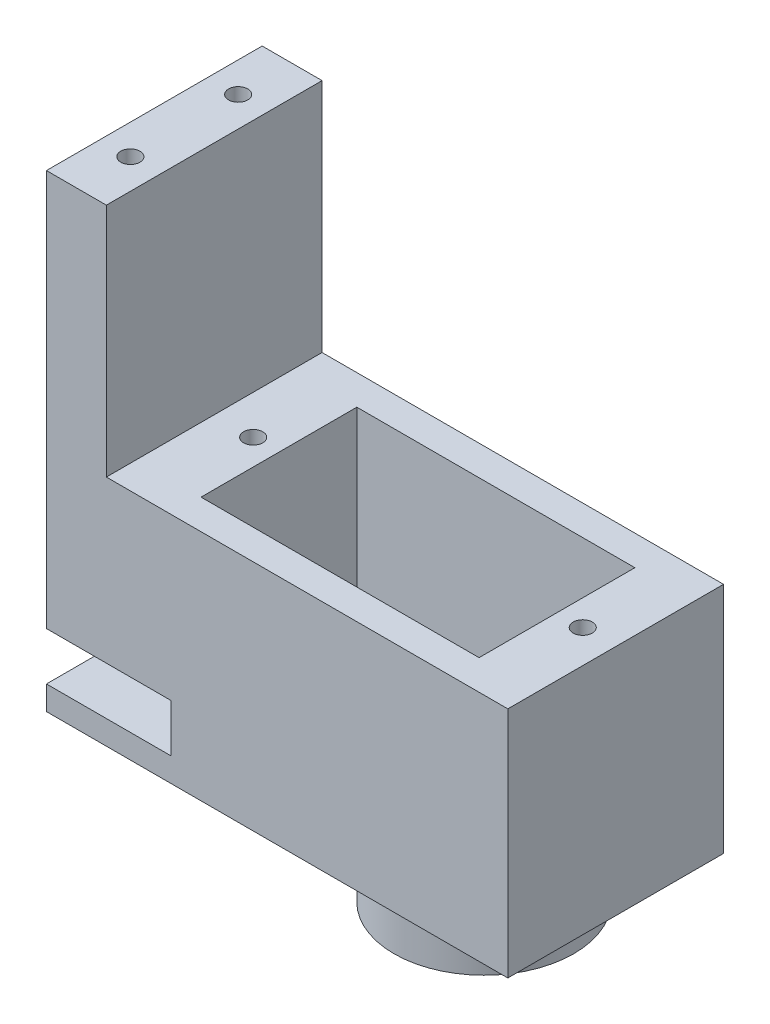
ISO-10303-21;
HEADER;
FILE_DESCRIPTION(('STEP AP214'),'2;1');
FILE_NAME('part.step','',(''),(''),'','','');
FILE_SCHEMA(('AUTOMOTIVE_DESIGN { 1 0 10303 214 1 1 1 1 }'));
ENDSEC;
DATA;
#1=APPLICATION_CONTEXT('core data for automotive mechanical design processes');
#2=APPLICATION_PROTOCOL_DEFINITION('international standard','automotive_design',2000,#1);
#3=PRODUCT_CONTEXT('',#1,'mechanical');
#4=PRODUCT('Part','Part','',(#3));
#5=PRODUCT_RELATED_PRODUCT_CATEGORY('part','',(#4));
#6=PRODUCT_DEFINITION_FORMATION('','',#4);
#7=PRODUCT_DEFINITION_CONTEXT('part definition',#1,'design');
#8=PRODUCT_DEFINITION('design','',#6,#7);
#9=PRODUCT_DEFINITION_SHAPE('','',#8);
#10=(LENGTH_UNIT() NAMED_UNIT(*) SI_UNIT(.MILLI.,.METRE.));
#11=(NAMED_UNIT(*) PLANE_ANGLE_UNIT() SI_UNIT($,.RADIAN.));
#12=(NAMED_UNIT(*) SI_UNIT($,.STERADIAN.) SOLID_ANGLE_UNIT());
#13=UNCERTAINTY_MEASURE_WITH_UNIT(LENGTH_MEASURE(1.E-05),#10,'distance_accuracy_value','');
#14=(GEOMETRIC_REPRESENTATION_CONTEXT(3) GLOBAL_UNCERTAINTY_ASSIGNED_CONTEXT((#13)) GLOBAL_UNIT_ASSIGNED_CONTEXT((#10,
#11,#12)) REPRESENTATION_CONTEXT('',''));
#15=CARTESIAN_POINT('',(0.,0.,0.));
#16=DIRECTION('',(0.,0.,1.));
#17=DIRECTION('',(1.,0.,0.));
#18=AXIS2_PLACEMENT_3D('',#15,#16,#17);
#19=CARTESIAN_POINT('',(-22.,-14.3,9.));
#20=DIRECTION('',(1.,0.,0.));
#21=DIRECTION('',(0.,0.,-1.));
#22=AXIS2_PLACEMENT_3D('',#19,#20,#21);
#23=PLANE('',#22);
#24=DIRECTION('',(0.,-1.,0.));
#25=VECTOR('',#24,1.);
#26=CARTESIAN_POINT('',(-22.,-14.3,-9.));
#27=LINE('',#26,#25);
#28=CARTESIAN_POINT('',(-22.,24.8,-9.));
#29=VERTEX_POINT('',#28);
#30=CARTESIAN_POINT('',(-22.,-8.3,-9.));
#31=VERTEX_POINT('',#30);
#32=EDGE_CURVE('E199',#29,#31,#27,.T.);
#33=ORIENTED_EDGE('',*,*,#32,.T.);
#34=DIRECTION('',(0.,0.,1.));
#35=VECTOR('',#34,1.);
#36=CARTESIAN_POINT('',(-22.,-8.3,-9.));
#37=LINE('',#36,#35);
#38=CARTESIAN_POINT('',(-22.,-8.3,9.));
#39=VERTEX_POINT('',#38);
#40=EDGE_CURVE('E312',#31,#39,#37,.T.);
#41=ORIENTED_EDGE('',*,*,#40,.T.);
#42=DIRECTION('',(0.,-1.,0.));
#43=VECTOR('',#42,1.);
#44=CARTESIAN_POINT('',(-22.,-14.3,9.));
#45=LINE('',#44,#43);
#46=CARTESIAN_POINT('',(-22.,24.8,9.));
#47=VERTEX_POINT('',#46);
#48=EDGE_CURVE('E177',#47,#39,#45,.T.);
#49=ORIENTED_EDGE('',*,*,#48,.F.);
#50=DIRECTION('',(0.,0.,-1.));
#51=VECTOR('',#50,1.);
#52=CARTESIAN_POINT('',(-22.,24.8,9.));
#53=LINE('',#52,#51);
#54=EDGE_CURVE('E242',#47,#29,#53,.T.);
#55=ORIENTED_EDGE('',*,*,#54,.T.);
#56=EDGE_LOOP('',(#33,#41,#49,#55));
#57=FACE_BOUND('',#56,.T.);
#58=ADVANCED_FACE('F39',(#57),#23,.F.);
#59=CARTESIAN_POINT('',(-22.,5.15,9.));
#60=DIRECTION('',(0.,-1.,0.));
#61=DIRECTION('',(0.,0.,-1.));
#62=AXIS2_PLACEMENT_3D('',#59,#60,#61);
#63=PLANE('',#62);
#64=CARTESIAN_POINT('',(13.75,5.15,0.));
#65=DIRECTION('',(0.,1.,0.));
#66=DIRECTION('',(0.,0.,1.));
#67=AXIS2_PLACEMENT_3D('',#64,#65,#66);
#68=CIRCLE('',#67,0.800000000000001);
#69=CARTESIAN_POINT('',(13.75,5.15,0.800000000000001));
#70=VERTEX_POINT('',#69);
#71=EDGE_CURVE('E347',#70,#70,#68,.T.);
#72=ORIENTED_EDGE('',*,*,#71,.F.);
#73=EDGE_LOOP('',(#72));
#74=FACE_BOUND('',#73,.T.);
#75=CARTESIAN_POINT('',(-13.75,5.15,0.));
#76=DIRECTION('',(0.,1.,0.));
#77=DIRECTION('',(0.,0.,1.));
#78=AXIS2_PLACEMENT_3D('',#75,#76,#77);
#79=CIRCLE('',#78,0.800000000000001);
#80=CARTESIAN_POINT('',(-13.75,5.15,0.800000000000001));
#81=VERTEX_POINT('',#80);
#82=EDGE_CURVE('E339',#81,#81,#79,.T.);
#83=ORIENTED_EDGE('',*,*,#82,.F.);
#84=EDGE_LOOP('',(#83));
#85=FACE_BOUND('',#84,.T.);
#86=DIRECTION('',(1.,0.,0.));
#87=VECTOR('',#86,1.);
#88=CARTESIAN_POINT('',(-11.6,5.15,6.5));
#89=LINE('',#88,#87);
#90=CARTESIAN_POINT('',(-11.6,5.15,6.5));
#91=VERTEX_POINT('',#90);
#92=CARTESIAN_POINT('',(11.6,5.15,6.5));
#93=VERTEX_POINT('',#92);
#94=EDGE_CURVE('E291',#91,#93,#89,.T.);
#95=ORIENTED_EDGE('',*,*,#94,.F.);
#96=DIRECTION('',(0.,0.,1.));
#97=VECTOR('',#96,1.);
#98=CARTESIAN_POINT('',(-11.6,5.15,6.5));
#99=LINE('',#98,#97);
#100=CARTESIAN_POINT('',(-11.6,5.15,-6.5));
#101=VERTEX_POINT('',#100);
#102=EDGE_CURVE('E294',#101,#91,#99,.T.);
#103=ORIENTED_EDGE('',*,*,#102,.F.);
#104=DIRECTION('',(-1.,0.,0.));
#105=VECTOR('',#104,1.);
#106=CARTESIAN_POINT('',(-11.6,5.15,-6.5));
#107=LINE('',#106,#105);
#108=CARTESIAN_POINT('',(11.6,5.15,-6.5));
#109=VERTEX_POINT('',#108);
#110=EDGE_CURVE('E282',#109,#101,#107,.T.);
#111=ORIENTED_EDGE('',*,*,#110,.F.);
#112=DIRECTION('',(0.,0.,-1.));
#113=VECTOR('',#112,1.);
#114=CARTESIAN_POINT('',(11.6,5.15,6.5));
#115=LINE('',#114,#113);
#116=EDGE_CURVE('E287',#93,#109,#115,.T.);
#117=ORIENTED_EDGE('',*,*,#116,.F.);
#118=EDGE_LOOP('',(#95,#103,#111,#117));
#119=FACE_BOUND('',#118,.T.);
#120=DIRECTION('',(0.,0.,-1.));
#121=VECTOR('',#120,1.);
#122=CARTESIAN_POINT('',(-17.,5.15,9.));
#123=LINE('',#122,#121);
#124=CARTESIAN_POINT('',(-17.,5.15,9.));
#125=VERTEX_POINT('',#124);
#126=CARTESIAN_POINT('',(-17.,5.15,-9.));
#127=VERTEX_POINT('',#126);
#128=EDGE_CURVE('E187',#125,#127,#123,.T.);
#129=ORIENTED_EDGE('',*,*,#128,.F.);
#130=DIRECTION('',(-1.,0.,0.));
#131=VECTOR('',#130,1.);
#132=CARTESIAN_POINT('',(-22.,5.15,9.));
#133=LINE('',#132,#131);
#134=CARTESIAN_POINT('',(16.5,5.15,9.));
#135=VERTEX_POINT('',#134);
#136=EDGE_CURVE('E194',#135,#125,#133,.T.);
#137=ORIENTED_EDGE('',*,*,#136,.F.);
#138=DIRECTION('',(0.,0.,-1.));
#139=VECTOR('',#138,1.);
#140=CARTESIAN_POINT('',(16.5,5.15,9.));
#141=LINE('',#140,#139);
#142=CARTESIAN_POINT('',(16.5,5.15,-9.));
#143=VERTEX_POINT('',#142);
#144=EDGE_CURVE('E198',#135,#143,#141,.T.);
#145=ORIENTED_EDGE('',*,*,#144,.T.);
#146=DIRECTION('',(-1.,0.,0.));
#147=VECTOR('',#146,1.);
#148=CARTESIAN_POINT('',(-22.,5.15,-9.));
#149=LINE('',#148,#147);
#150=EDGE_CURVE('E178',#143,#127,#149,.T.);
#151=ORIENTED_EDGE('',*,*,#150,.T.);
#152=EDGE_LOOP('',(#129,#137,#145,#151));
#153=FACE_BOUND('',#152,.T.);
#154=ADVANCED_FACE('F230',(#74,#85,#119,#153),#63,.F.);
#155=CARTESIAN_POINT('',(-22.,-12.3,9.));
#156=VERTEX_POINT('',#155);
#157=CARTESIAN_POINT('',(-22.,-14.3,9.));
#158=VERTEX_POINT('',#157);
#159=EDGE_CURVE('E167',#156,#158,#45,.T.);
#160=ORIENTED_EDGE('',*,*,#159,.F.);
#161=DIRECTION('',(0.,0.,1.));
#162=VECTOR('',#161,1.);
#163=CARTESIAN_POINT('',(-22.,-12.3,-9.));
#164=LINE('',#163,#162);
#165=CARTESIAN_POINT('',(-22.,-12.3,-9.));
#166=VERTEX_POINT('',#165);
#167=EDGE_CURVE('E149',#166,#156,#164,.T.);
#168=ORIENTED_EDGE('',*,*,#167,.F.);
#169=CARTESIAN_POINT('',(-22.,-14.3,-9.));
#170=VERTEX_POINT('',#169);
#171=EDGE_CURVE('E204',#166,#170,#27,.T.);
#172=ORIENTED_EDGE('',*,*,#171,.T.);
#173=DIRECTION('',(0.,0.,-1.));
#174=VECTOR('',#173,1.);
#175=CARTESIAN_POINT('',(-22.,-14.3,9.));
#176=LINE('',#175,#174);
#177=EDGE_CURVE('E11',#158,#170,#176,.T.);
#178=ORIENTED_EDGE('',*,*,#177,.F.);
#179=EDGE_LOOP('',(#160,#168,#172,#178));
#180=FACE_BOUND('',#179,.T.);
#181=ADVANCED_FACE('F41',(#180),#23,.F.);
#182=CARTESIAN_POINT('',(-22.,-14.3,9.));
#183=DIRECTION('',(0.,1.,0.));
#184=DIRECTION('',(0.,0.,1.));
#185=AXIS2_PLACEMENT_3D('',#182,#183,#184);
#186=PLANE('',#185);
#187=CARTESIAN_POINT('',(5.5,-14.3,0.));
#188=DIRECTION('',(0.,1.,0.));
#189=DIRECTION('',(0.,0.,1.));
#190=AXIS2_PLACEMENT_3D('',#187,#188,#189);
#191=CIRCLE('',#190,7.5);
#192=CARTESIAN_POINT('',(5.5,-14.3,7.5));
#193=VERTEX_POINT('',#192);
#194=EDGE_CURVE('E256',#193,#193,#191,.T.);
#195=ORIENTED_EDGE('',*,*,#194,.T.);
#196=EDGE_LOOP('',(#195));
#197=FACE_BOUND('',#196,.T.);
#198=DIRECTION('',(1.,0.,0.));
#199=VECTOR('',#198,1.);
#200=CARTESIAN_POINT('',(-22.,-14.3,-9.));
#201=LINE('',#200,#199);
#202=CARTESIAN_POINT('',(16.5,-14.3,-9.));
#203=VERTEX_POINT('',#202);
#204=EDGE_CURVE('E203',#170,#203,#201,.T.);
#205=ORIENTED_EDGE('',*,*,#204,.T.);
#206=DIRECTION('',(0.,0.,-1.));
#207=VECTOR('',#206,1.);
#208=CARTESIAN_POINT('',(16.5,-14.3,9.));
#209=LINE('',#208,#207);
#210=CARTESIAN_POINT('',(16.5,-14.3,9.));
#211=VERTEX_POINT('',#210);
#212=EDGE_CURVE('E48',#211,#203,#209,.T.);
#213=ORIENTED_EDGE('',*,*,#212,.F.);
#214=DIRECTION('',(1.,0.,0.));
#215=VECTOR('',#214,1.);
#216=CARTESIAN_POINT('',(-22.,-14.3,9.));
#217=LINE('',#216,#215);
#218=EDGE_CURVE('E182',#158,#211,#217,.T.);
#219=ORIENTED_EDGE('',*,*,#218,.F.);
#220=ORIENTED_EDGE('',*,*,#177,.T.);
#221=EDGE_LOOP('',(#205,#213,#219,#220));
#222=FACE_BOUND('',#221,.T.);
#223=ADVANCED_FACE('F388',(#197,#222),#186,.F.);
#224=CARTESIAN_POINT('',(16.5,-14.3,9.));
#225=DIRECTION('',(-1.,0.,0.));
#226=DIRECTION('',(0.,0.,1.));
#227=AXIS2_PLACEMENT_3D('',#224,#225,#226);
#228=PLANE('',#227);
#229=DIRECTION('',(0.,1.,0.));
#230=VECTOR('',#229,1.);
#231=CARTESIAN_POINT('',(16.5,-14.3,-9.));
#232=LINE('',#231,#230);
#233=EDGE_CURVE('E183',#203,#143,#232,.T.);
#234=ORIENTED_EDGE('',*,*,#233,.T.);
#235=ORIENTED_EDGE('',*,*,#144,.F.);
#236=DIRECTION('',(0.,1.,0.));
#237=VECTOR('',#236,1.);
#238=CARTESIAN_POINT('',(16.5,-14.3,9.));
#239=LINE('',#238,#237);
#240=EDGE_CURVE('E191',#211,#135,#239,.T.);
#241=ORIENTED_EDGE('',*,*,#240,.F.);
#242=ORIENTED_EDGE('',*,*,#212,.T.);
#243=EDGE_LOOP('',(#234,#235,#241,#242));
#244=FACE_BOUND('',#243,.T.);
#245=ADVANCED_FACE('F217',(#244),#228,.F.);
#246=CARTESIAN_POINT('',(0.,0.,9.));
#247=DIRECTION('',(0.,0.,-1.));
#248=DIRECTION('',(-1.,0.,0.));
#249=AXIS2_PLACEMENT_3D('',#246,#247,#248);
#250=PLANE('',#249);
#251=ORIENTED_EDGE('',*,*,#48,.T.);
#252=DIRECTION('',(-1.,0.,0.));
#253=VECTOR('',#252,1.);
#254=CARTESIAN_POINT('',(-22.,-8.3,9.));
#255=LINE('',#254,#253);
#256=CARTESIAN_POINT('',(-11.6,-8.3,9.));
#257=VERTEX_POINT('',#256);
#258=EDGE_CURVE('E334',#257,#39,#255,.T.);
#259=ORIENTED_EDGE('',*,*,#258,.F.);
#260=DIRECTION('',(0.,1.,0.));
#261=VECTOR('',#260,1.);
#262=CARTESIAN_POINT('',(-11.6,-12.3,9.));
#263=LINE('',#262,#261);
#264=CARTESIAN_POINT('',(-11.6,-12.3,9.));
#265=VERTEX_POINT('',#264);
#266=EDGE_CURVE('E171',#265,#257,#263,.T.);
#267=ORIENTED_EDGE('',*,*,#266,.F.);
#268=DIRECTION('',(1.,0.,0.));
#269=VECTOR('',#268,1.);
#270=CARTESIAN_POINT('',(-22.,-12.3,9.));
#271=LINE('',#270,#269);
#272=EDGE_CURVE('E153',#156,#265,#271,.T.);
#273=ORIENTED_EDGE('',*,*,#272,.F.);
#274=ORIENTED_EDGE('',*,*,#159,.T.);
#275=ORIENTED_EDGE('',*,*,#218,.T.);
#276=ORIENTED_EDGE('',*,*,#240,.T.);
#277=ORIENTED_EDGE('',*,*,#136,.T.);
#278=DIRECTION('',(0.,1.,0.));
#279=VECTOR('',#278,1.);
#280=CARTESIAN_POINT('',(-17.,5.15,9.));
#281=LINE('',#280,#279);
#282=CARTESIAN_POINT('',(-17.,24.8,9.));
#283=VERTEX_POINT('',#282);
#284=EDGE_CURVE('E237',#125,#283,#281,.T.);
#285=ORIENTED_EDGE('',*,*,#284,.T.);
#286=DIRECTION('',(-1.,0.,0.));
#287=VECTOR('',#286,1.);
#288=CARTESIAN_POINT('',(-22.,24.8,9.));
#289=LINE('',#288,#287);
#290=EDGE_CURVE('E248',#283,#47,#289,.T.);
#291=ORIENTED_EDGE('',*,*,#290,.T.);
#292=EDGE_LOOP('',(#251,#259,#267,#273,#274,#275,#276,#277,#285,#291));
#293=FACE_BOUND('',#292,.T.);
#294=ADVANCED_FACE('F166',(#293),#250,.F.);
#295=CARTESIAN_POINT('',(0.,0.,-9.));
#296=DIRECTION('',(0.,0.,-1.));
#297=DIRECTION('',(-1.,0.,0.));
#298=AXIS2_PLACEMENT_3D('',#295,#296,#297);
#299=PLANE('',#298);
#300=DIRECTION('',(-1.,0.,0.));
#301=VECTOR('',#300,1.);
#302=CARTESIAN_POINT('',(-22.,-8.3,-9.));
#303=LINE('',#302,#301);
#304=CARTESIAN_POINT('',(-11.6,-8.3,-9.));
#305=VERTEX_POINT('',#304);
#306=EDGE_CURVE('E162',#305,#31,#303,.T.);
#307=ORIENTED_EDGE('',*,*,#306,.T.);
#308=ORIENTED_EDGE('',*,*,#32,.F.);
#309=DIRECTION('',(-1.,0.,0.));
#310=VECTOR('',#309,1.);
#311=CARTESIAN_POINT('',(-22.,24.8,-9.));
#312=LINE('',#311,#310);
#313=CARTESIAN_POINT('',(-17.,24.8,-9.));
#314=VERTEX_POINT('',#313);
#315=EDGE_CURVE('E251',#314,#29,#312,.T.);
#316=ORIENTED_EDGE('',*,*,#315,.F.);
#317=DIRECTION('',(0.,1.,0.));
#318=VECTOR('',#317,1.);
#319=CARTESIAN_POINT('',(-17.,5.15,-9.));
#320=LINE('',#319,#318);
#321=EDGE_CURVE('E227',#127,#314,#320,.T.);
#322=ORIENTED_EDGE('',*,*,#321,.F.);
#323=ORIENTED_EDGE('',*,*,#150,.F.);
#324=ORIENTED_EDGE('',*,*,#233,.F.);
#325=ORIENTED_EDGE('',*,*,#204,.F.);
#326=ORIENTED_EDGE('',*,*,#171,.F.);
#327=DIRECTION('',(1.,0.,0.));
#328=VECTOR('',#327,1.);
#329=CARTESIAN_POINT('',(-22.,-12.3,-9.));
#330=LINE('',#329,#328);
#331=CARTESIAN_POINT('',(-11.6,-12.3,-9.));
#332=VERTEX_POINT('',#331);
#333=EDGE_CURVE('E156',#166,#332,#330,.T.);
#334=ORIENTED_EDGE('',*,*,#333,.T.);
#335=DIRECTION('',(0.,1.,0.));
#336=VECTOR('',#335,1.);
#337=CARTESIAN_POINT('',(-11.6,-12.3,-9.));
#338=LINE('',#337,#336);
#339=EDGE_CURVE('E55',#332,#305,#338,.T.);
#340=ORIENTED_EDGE('',*,*,#339,.T.);
#341=EDGE_LOOP('',(#307,#308,#316,#322,#323,#324,#325,#326,#334,#340));
#342=FACE_BOUND('',#341,.T.);
#343=ADVANCED_FACE('F224',(#342),#299,.T.);
#344=CARTESIAN_POINT('',(-17.,5.15,9.));
#345=DIRECTION('',(-1.,0.,0.));
#346=DIRECTION('',(0.,0.,1.));
#347=AXIS2_PLACEMENT_3D('',#344,#345,#346);
#348=PLANE('',#347);
#349=ORIENTED_EDGE('',*,*,#321,.T.);
#350=DIRECTION('',(0.,0.,-1.));
#351=VECTOR('',#350,1.);
#352=CARTESIAN_POINT('',(-17.,24.8,9.));
#353=LINE('',#352,#351);
#354=EDGE_CURVE('E239',#283,#314,#353,.T.);
#355=ORIENTED_EDGE('',*,*,#354,.F.);
#356=ORIENTED_EDGE('',*,*,#284,.F.);
#357=ORIENTED_EDGE('',*,*,#128,.T.);
#358=EDGE_LOOP('',(#349,#355,#356,#357));
#359=FACE_BOUND('',#358,.T.);
#360=ADVANCED_FACE('F234',(#359),#348,.F.);
#361=CARTESIAN_POINT('',(-22.,24.8,9.));
#362=DIRECTION('',(0.,-1.,0.));
#363=DIRECTION('',(0.,0.,-1.));
#364=AXIS2_PLACEMENT_3D('',#361,#362,#363);
#365=PLANE('',#364);
#366=CARTESIAN_POINT('',(-19.5,24.8,-4.5));
#367=DIRECTION('',(0.,1.,0.));
#368=DIRECTION('',(0.,0.,1.));
#369=AXIS2_PLACEMENT_3D('',#366,#367,#368);
#370=CIRCLE('',#369,0.799999999999999);
#371=CARTESIAN_POINT('',(-19.5,24.8,-3.7));
#372=VERTEX_POINT('',#371);
#373=EDGE_CURVE('E363',#372,#372,#370,.T.);
#374=ORIENTED_EDGE('',*,*,#373,.F.);
#375=EDGE_LOOP('',(#374));
#376=FACE_BOUND('',#375,.T.);
#377=CARTESIAN_POINT('',(-19.5,24.8,4.5));
#378=DIRECTION('',(0.,1.,0.));
#379=DIRECTION('',(0.,0.,1.));
#380=AXIS2_PLACEMENT_3D('',#377,#378,#379);
#381=CIRCLE('',#380,0.799999999999999);
#382=CARTESIAN_POINT('',(-19.5,24.8,5.3));
#383=VERTEX_POINT('',#382);
#384=EDGE_CURVE('E355',#383,#383,#381,.T.);
#385=ORIENTED_EDGE('',*,*,#384,.F.);
#386=EDGE_LOOP('',(#385));
#387=FACE_BOUND('',#386,.T.);
#388=ORIENTED_EDGE('',*,*,#315,.T.);
#389=ORIENTED_EDGE('',*,*,#54,.F.);
#390=ORIENTED_EDGE('',*,*,#290,.F.);
#391=ORIENTED_EDGE('',*,*,#354,.T.);
#392=EDGE_LOOP('',(#388,#389,#390,#391));
#393=FACE_BOUND('',#392,.T.);
#394=ADVANCED_FACE('F380',(#376,#387,#393),#365,.F.);
#395=CARTESIAN_POINT('',(5.5,-14.3,0.));
#396=DIRECTION('',(0.,-1.,0.));
#397=DIRECTION('',(0.,0.,-1.));
#398=AXIS2_PLACEMENT_3D('',#395,#396,#397);
#399=CYLINDRICAL_SURFACE('',#398,7.5);
#400=ORIENTED_EDGE('',*,*,#194,.F.);
#401=EDGE_LOOP('',(#400));
#402=FACE_BOUND('',#401,.T.);
#403=CARTESIAN_POINT('',(5.5,-18.8,0.));
#404=DIRECTION('',(0.,1.,0.));
#405=DIRECTION('',(0.,0.,1.));
#406=AXIS2_PLACEMENT_3D('',#403,#404,#405);
#407=CIRCLE('',#406,7.5);
#408=CARTESIAN_POINT('',(5.5,-18.8,7.5));
#409=VERTEX_POINT('',#408);
#410=EDGE_CURVE('E262',#409,#409,#407,.T.);
#411=ORIENTED_EDGE('',*,*,#410,.T.);
#412=EDGE_LOOP('',(#411));
#413=FACE_BOUND('',#412,.T.);
#414=ADVANCED_FACE('F383',(#402,#413),#399,.T.);
#415=CARTESIAN_POINT('',(5.5,-18.8,0.));
#416=DIRECTION('',(0.,1.,0.));
#417=DIRECTION('',(0.,0.,1.));
#418=AXIS2_PLACEMENT_3D('',#415,#416,#417);
#419=PLANE('',#418);
#420=CARTESIAN_POINT('',(5.5,-18.8,0.));
#421=DIRECTION('',(0.,1.,0.));
#422=DIRECTION('',(0.,0.,1.));
#423=AXIS2_PLACEMENT_3D('',#420,#421,#422);
#424=CIRCLE('',#423,5.);
#425=CARTESIAN_POINT('',(5.5,-18.8,5.));
#426=VERTEX_POINT('',#425);
#427=EDGE_CURVE('E308',#426,#426,#424,.T.);
#428=ORIENTED_EDGE('',*,*,#427,.T.);
#429=EDGE_LOOP('',(#428));
#430=FACE_BOUND('',#429,.T.);
#431=ORIENTED_EDGE('',*,*,#410,.F.);
#432=EDGE_LOOP('',(#431));
#433=FACE_BOUND('',#432,.T.);
#434=ADVANCED_FACE('F415',(#430,#433),#419,.F.);
#435=CARTESIAN_POINT('',(-11.6,-12.3,6.5));
#436=DIRECTION('',(-1.,0.,0.));
#437=DIRECTION('',(0.,0.,1.));
#438=AXIS2_PLACEMENT_3D('',#435,#436,#437);
#439=PLANE('',#438);
#440=DIRECTION('',(0.,1.,0.));
#441=VECTOR('',#440,1.);
#442=CARTESIAN_POINT('',(-11.6,-12.3,6.5));
#443=LINE('',#442,#441);
#444=CARTESIAN_POINT('',(-11.6,-8.3,6.5));
#445=VERTEX_POINT('',#444);
#446=EDGE_CURVE('E63',#445,#91,#443,.T.);
#447=ORIENTED_EDGE('',*,*,#446,.F.);
#448=DIRECTION('',(0.,0.,1.));
#449=VECTOR('',#448,1.);
#450=CARTESIAN_POINT('',(-11.6,-8.3,-9.));
#451=LINE('',#450,#449);
#452=CARTESIAN_POINT('',(-11.6,-8.3,-6.5));
#453=VERTEX_POINT('',#452);
#454=EDGE_CURVE('E324',#453,#445,#451,.T.);
#455=ORIENTED_EDGE('',*,*,#454,.F.);
#456=DIRECTION('',(0.,1.,0.));
#457=VECTOR('',#456,1.);
#458=CARTESIAN_POINT('',(-11.6,-12.3,-6.5));
#459=LINE('',#458,#457);
#460=EDGE_CURVE('E279',#453,#101,#459,.T.);
#461=ORIENTED_EDGE('',*,*,#460,.T.);
#462=ORIENTED_EDGE('',*,*,#102,.T.);
#463=EDGE_LOOP('',(#447,#455,#461,#462));
#464=FACE_BOUND('',#463,.T.);
#465=ADVANCED_FACE('F419',(#464),#439,.F.);
#466=CARTESIAN_POINT('',(-11.6,-12.3,-6.5));
#467=DIRECTION('',(0.,0.,-1.));
#468=DIRECTION('',(-1.,0.,0.));
#469=AXIS2_PLACEMENT_3D('',#466,#467,#468);
#470=PLANE('',#469);
#471=ORIENTED_EDGE('',*,*,#110,.T.);
#472=ORIENTED_EDGE('',*,*,#460,.F.);
#473=CARTESIAN_POINT('',(-11.6,-12.3,-6.5));
#474=VERTEX_POINT('',#473);
#475=EDGE_CURVE('E266',#474,#453,#459,.T.);
#476=ORIENTED_EDGE('',*,*,#475,.F.);
#477=DIRECTION('',(-1.,0.,0.));
#478=VECTOR('',#477,1.);
#479=CARTESIAN_POINT('',(-11.6,-12.3,-6.5));
#480=LINE('',#479,#478);
#481=CARTESIAN_POINT('',(11.6,-12.3,-6.5));
#482=VERTEX_POINT('',#481);
#483=EDGE_CURVE('E298',#482,#474,#480,.T.);
#484=ORIENTED_EDGE('',*,*,#483,.F.);
#485=DIRECTION('',(0.,1.,0.));
#486=VECTOR('',#485,1.);
#487=CARTESIAN_POINT('',(11.6,-12.3,-6.5));
#488=LINE('',#487,#486);
#489=EDGE_CURVE('E276',#482,#109,#488,.T.);
#490=ORIENTED_EDGE('',*,*,#489,.T.);
#491=EDGE_LOOP('',(#471,#472,#476,#484,#490));
#492=FACE_BOUND('',#491,.T.);
#493=ADVANCED_FACE('F423',(#492),#470,.F.);
#494=CARTESIAN_POINT('',(11.6,-12.3,6.5));
#495=DIRECTION('',(1.,0.,0.));
#496=DIRECTION('',(0.,0.,-1.));
#497=AXIS2_PLACEMENT_3D('',#494,#495,#496);
#498=PLANE('',#497);
#499=ORIENTED_EDGE('',*,*,#116,.T.);
#500=ORIENTED_EDGE('',*,*,#489,.F.);
#501=DIRECTION('',(0.,0.,-1.));
#502=VECTOR('',#501,1.);
#503=CARTESIAN_POINT('',(11.6,-12.3,6.5));
#504=LINE('',#503,#502);
#505=CARTESIAN_POINT('',(11.6,-12.3,6.5));
#506=VERTEX_POINT('',#505);
#507=EDGE_CURVE('E301',#506,#482,#504,.T.);
#508=ORIENTED_EDGE('',*,*,#507,.F.);
#509=DIRECTION('',(0.,1.,0.));
#510=VECTOR('',#509,1.);
#511=CARTESIAN_POINT('',(11.6,-12.3,6.5));
#512=LINE('',#511,#510);
#513=EDGE_CURVE('E273',#506,#93,#512,.T.);
#514=ORIENTED_EDGE('',*,*,#513,.T.);
#515=EDGE_LOOP('',(#499,#500,#508,#514));
#516=FACE_BOUND('',#515,.T.);
#517=ADVANCED_FACE('F428',(#516),#498,.F.);
#518=CARTESIAN_POINT('',(-11.6,-12.3,6.5));
#519=DIRECTION('',(0.,0.,1.));
#520=DIRECTION('',(1.,0.,0.));
#521=AXIS2_PLACEMENT_3D('',#518,#519,#520);
#522=PLANE('',#521);
#523=ORIENTED_EDGE('',*,*,#94,.T.);
#524=ORIENTED_EDGE('',*,*,#513,.F.);
#525=DIRECTION('',(1.,0.,0.));
#526=VECTOR('',#525,1.);
#527=CARTESIAN_POINT('',(-11.6,-12.3,6.5));
#528=LINE('',#527,#526);
#529=CARTESIAN_POINT('',(-11.6,-12.3,6.5));
#530=VERTEX_POINT('',#529);
#531=EDGE_CURVE('E286',#530,#506,#528,.T.);
#532=ORIENTED_EDGE('',*,*,#531,.F.);
#533=EDGE_CURVE('E270',#530,#445,#443,.T.);
#534=ORIENTED_EDGE('',*,*,#533,.T.);
#535=ORIENTED_EDGE('',*,*,#446,.T.);
#536=EDGE_LOOP('',(#523,#524,#532,#534,#535));
#537=FACE_BOUND('',#536,.T.);
#538=ADVANCED_FACE('F425',(#537),#522,.F.);
#539=CARTESIAN_POINT('',(0.,-12.3,0.));
#540=DIRECTION('',(0.,-1.,0.));
#541=DIRECTION('',(0.,0.,-1.));
#542=AXIS2_PLACEMENT_3D('',#539,#540,#541);
#543=PLANE('',#542);
#544=ORIENTED_EDGE('',*,*,#483,.T.);
#545=DIRECTION('',(0.,0.,1.));
#546=VECTOR('',#545,1.);
#547=CARTESIAN_POINT('',(-11.6,-12.3,-9.));
#548=LINE('',#547,#546);
#549=EDGE_CURVE('E316',#332,#474,#548,.T.);
#550=ORIENTED_EDGE('',*,*,#549,.F.);
#551=ORIENTED_EDGE('',*,*,#333,.F.);
#552=ORIENTED_EDGE('',*,*,#167,.T.);
#553=ORIENTED_EDGE('',*,*,#272,.T.);
#554=EDGE_CURVE('E161',#530,#265,#548,.T.);
#555=ORIENTED_EDGE('',*,*,#554,.F.);
#556=ORIENTED_EDGE('',*,*,#531,.T.);
#557=ORIENTED_EDGE('',*,*,#507,.T.);
#558=EDGE_LOOP('',(#544,#550,#551,#552,#553,#555,#556,#557));
#559=FACE_BOUND('',#558,.T.);
#560=ADVANCED_FACE('F152',(#559),#543,.F.);
#561=CARTESIAN_POINT('',(5.5,-14.8,0.));
#562=DIRECTION('',(0.,-1.,0.));
#563=DIRECTION('',(0.,0.,-1.));
#564=AXIS2_PLACEMENT_3D('',#561,#562,#563);
#565=CYLINDRICAL_SURFACE('',#564,5.);
#566=CARTESIAN_POINT('',(5.5,-14.8,0.));
#567=DIRECTION('',(0.,1.,0.));
#568=DIRECTION('',(0.,0.,1.));
#569=AXIS2_PLACEMENT_3D('',#566,#567,#568);
#570=CIRCLE('',#569,5.);
#571=CARTESIAN_POINT('',(5.5,-14.8,5.));
#572=VERTEX_POINT('',#571);
#573=EDGE_CURVE('E297',#572,#572,#570,.T.);
#574=ORIENTED_EDGE('',*,*,#573,.T.);
#575=EDGE_LOOP('',(#574));
#576=FACE_BOUND('',#575,.T.);
#577=ORIENTED_EDGE('',*,*,#427,.F.);
#578=EDGE_LOOP('',(#577));
#579=FACE_BOUND('',#578,.T.);
#580=ADVANCED_FACE('F437',(#576,#579),#565,.F.);
#581=CARTESIAN_POINT('',(5.5,-14.8,0.));
#582=DIRECTION('',(0.,1.,0.));
#583=DIRECTION('',(0.,0.,1.));
#584=AXIS2_PLACEMENT_3D('',#581,#582,#583);
#585=PLANE('',#584);
#586=ORIENTED_EDGE('',*,*,#573,.F.);
#587=EDGE_LOOP('',(#586));
#588=FACE_BOUND('',#587,.T.);
#589=ADVANCED_FACE('F440',(#588),#585,.F.);
#590=CARTESIAN_POINT('',(-11.6,-12.3,-9.));
#591=DIRECTION('',(1.,0.,0.));
#592=DIRECTION('',(0.,0.,-1.));
#593=AXIS2_PLACEMENT_3D('',#590,#591,#592);
#594=PLANE('',#593);
#595=EDGE_CURVE('E320',#305,#453,#451,.T.);
#596=ORIENTED_EDGE('',*,*,#595,.F.);
#597=ORIENTED_EDGE('',*,*,#339,.F.);
#598=ORIENTED_EDGE('',*,*,#549,.T.);
#599=ORIENTED_EDGE('',*,*,#475,.T.);
#600=EDGE_LOOP('',(#596,#597,#598,#599));
#601=FACE_BOUND('',#600,.T.);
#602=ADVANCED_FACE('F444',(#601),#594,.F.);
#603=ORIENTED_EDGE('',*,*,#554,.T.);
#604=ORIENTED_EDGE('',*,*,#266,.T.);
#605=EDGE_CURVE('E319',#445,#257,#451,.T.);
#606=ORIENTED_EDGE('',*,*,#605,.F.);
#607=ORIENTED_EDGE('',*,*,#533,.F.);
#608=EDGE_LOOP('',(#603,#604,#606,#607));
#609=FACE_BOUND('',#608,.T.);
#610=ADVANCED_FACE('F448',(#609),#594,.F.);
#611=CARTESIAN_POINT('',(-22.,-8.3,-9.));
#612=DIRECTION('',(0.,1.,0.));
#613=DIRECTION('',(0.,0.,1.));
#614=AXIS2_PLACEMENT_3D('',#611,#612,#613);
#615=PLANE('',#614);
#616=ORIENTED_EDGE('',*,*,#40,.F.);
#617=ORIENTED_EDGE('',*,*,#306,.F.);
#618=ORIENTED_EDGE('',*,*,#595,.T.);
#619=ORIENTED_EDGE('',*,*,#454,.T.);
#620=ORIENTED_EDGE('',*,*,#605,.T.);
#621=ORIENTED_EDGE('',*,*,#258,.T.);
#622=EDGE_LOOP('',(#616,#617,#618,#619,#620,#621));
#623=FACE_BOUND('',#622,.T.);
#624=ADVANCED_FACE('F449',(#623),#615,.F.);
#625=CARTESIAN_POINT('',(-13.75,-2.85,0.));
#626=DIRECTION('',(0.,1.,0.));
#627=DIRECTION('',(0.,0.,1.));
#628=AXIS2_PLACEMENT_3D('',#625,#626,#627);
#629=CYLINDRICAL_SURFACE('',#628,0.800000000000001);
#630=CARTESIAN_POINT('',(-13.75,-2.85,0.));
#631=DIRECTION('',(0.,1.,0.));
#632=DIRECTION('',(0.,0.,1.));
#633=AXIS2_PLACEMENT_3D('',#630,#631,#632);
#634=CIRCLE('',#633,0.800000000000001);
#635=CARTESIAN_POINT('',(-13.75,-2.85,0.800000000000001));
#636=VERTEX_POINT('',#635);
#637=EDGE_CURVE('E173',#636,#636,#634,.T.);
#638=ORIENTED_EDGE('',*,*,#637,.F.);
#639=EDGE_LOOP('',(#638));
#640=FACE_BOUND('',#639,.T.);
#641=ORIENTED_EDGE('',*,*,#82,.T.);
#642=EDGE_LOOP('',(#641));
#643=FACE_BOUND('',#642,.T.);
#644=ADVANCED_FACE('F452',(#640,#643),#629,.F.);
#645=CARTESIAN_POINT('',(-13.75,-2.85,0.));
#646=DIRECTION('',(0.,1.,0.));
#647=DIRECTION('',(0.,0.,1.));
#648=AXIS2_PLACEMENT_3D('',#645,#646,#647);
#649=PLANE('',#648);
#650=ORIENTED_EDGE('',*,*,#637,.T.);
#651=EDGE_LOOP('',(#650));
#652=FACE_BOUND('',#651,.T.);
#653=ADVANCED_FACE('F456',(#652),#649,.T.);
#654=CARTESIAN_POINT('',(13.75,-2.85,0.));
#655=DIRECTION('',(0.,1.,0.));
#656=DIRECTION('',(0.,0.,1.));
#657=AXIS2_PLACEMENT_3D('',#654,#655,#656);
#658=CYLINDRICAL_SURFACE('',#657,0.800000000000001);
#659=CARTESIAN_POINT('',(13.75,-2.85,0.));
#660=DIRECTION('',(0.,1.,0.));
#661=DIRECTION('',(0.,0.,1.));
#662=AXIS2_PLACEMENT_3D('',#659,#660,#661);
#663=CIRCLE('',#662,0.800000000000001);
#664=CARTESIAN_POINT('',(13.75,-2.85,0.800000000000001));
#665=VERTEX_POINT('',#664);
#666=EDGE_CURVE('E343',#665,#665,#663,.T.);
#667=ORIENTED_EDGE('',*,*,#666,.F.);
#668=EDGE_LOOP('',(#667));
#669=FACE_BOUND('',#668,.T.);
#670=ORIENTED_EDGE('',*,*,#71,.T.);
#671=EDGE_LOOP('',(#670));
#672=FACE_BOUND('',#671,.T.);
#673=ADVANCED_FACE('F460',(#669,#672),#658,.F.);
#674=CARTESIAN_POINT('',(13.75,-2.85,0.));
#675=DIRECTION('',(0.,1.,0.));
#676=DIRECTION('',(0.,0.,1.));
#677=AXIS2_PLACEMENT_3D('',#674,#675,#676);
#678=PLANE('',#677);
#679=ORIENTED_EDGE('',*,*,#666,.T.);
#680=EDGE_LOOP('',(#679));
#681=FACE_BOUND('',#680,.T.);
#682=ADVANCED_FACE('F464',(#681),#678,.T.);
#683=CARTESIAN_POINT('',(-19.5,14.8,4.5));
#684=DIRECTION('',(0.,1.,0.));
#685=DIRECTION('',(0.,0.,1.));
#686=AXIS2_PLACEMENT_3D('',#683,#684,#685);
#687=CYLINDRICAL_SURFACE('',#686,0.799999999999999);
#688=CARTESIAN_POINT('',(-19.5,14.8,4.5));
#689=DIRECTION('',(0.,1.,0.));
#690=DIRECTION('',(0.,0.,1.));
#691=AXIS2_PLACEMENT_3D('',#688,#689,#690);
#692=CIRCLE('',#691,0.799999999999999);
#693=CARTESIAN_POINT('',(-19.5,14.8,5.3));
#694=VERTEX_POINT('',#693);
#695=EDGE_CURVE('E351',#694,#694,#692,.T.);
#696=ORIENTED_EDGE('',*,*,#695,.F.);
#697=EDGE_LOOP('',(#696));
#698=FACE_BOUND('',#697,.T.);
#699=ORIENTED_EDGE('',*,*,#384,.T.);
#700=EDGE_LOOP('',(#699));
#701=FACE_BOUND('',#700,.T.);
#702=ADVANCED_FACE('F468',(#698,#701),#687,.F.);
#703=CARTESIAN_POINT('',(-19.5,14.8,4.5));
#704=DIRECTION('',(0.,1.,0.));
#705=DIRECTION('',(0.,0.,1.));
#706=AXIS2_PLACEMENT_3D('',#703,#704,#705);
#707=PLANE('',#706);
#708=ORIENTED_EDGE('',*,*,#695,.T.);
#709=EDGE_LOOP('',(#708));
#710=FACE_BOUND('',#709,.T.);
#711=ADVANCED_FACE('F376',(#710),#707,.T.);
#712=CARTESIAN_POINT('',(-19.5,14.8,-4.5));
#713=DIRECTION('',(0.,1.,0.));
#714=DIRECTION('',(0.,0.,1.));
#715=AXIS2_PLACEMENT_3D('',#712,#713,#714);
#716=CYLINDRICAL_SURFACE('',#715,0.799999999999999);
#717=CARTESIAN_POINT('',(-19.5,14.8,-4.5));
#718=DIRECTION('',(0.,1.,0.));
#719=DIRECTION('',(0.,0.,1.));
#720=AXIS2_PLACEMENT_3D('',#717,#718,#719);
#721=CIRCLE('',#720,0.799999999999999);
#722=CARTESIAN_POINT('',(-19.5,14.8,-3.7));
#723=VERTEX_POINT('',#722);
#724=EDGE_CURVE('E359',#723,#723,#721,.T.);
#725=ORIENTED_EDGE('',*,*,#724,.F.);
#726=EDGE_LOOP('',(#725));
#727=FACE_BOUND('',#726,.T.);
#728=ORIENTED_EDGE('',*,*,#373,.T.);
#729=EDGE_LOOP('',(#728));
#730=FACE_BOUND('',#729,.T.);
#731=ADVANCED_FACE('F373',(#727,#730),#716,.F.);
#732=CARTESIAN_POINT('',(-19.5,14.8,-4.5));
#733=DIRECTION('',(0.,1.,0.));
#734=DIRECTION('',(0.,0.,1.));
#735=AXIS2_PLACEMENT_3D('',#732,#733,#734);
#736=PLANE('',#735);
#737=ORIENTED_EDGE('',*,*,#724,.T.);
#738=EDGE_LOOP('',(#737));
#739=FACE_BOUND('',#738,.T.);
#740=ADVANCED_FACE('F371',(#739),#736,.T.);
#741=CLOSED_SHELL('',(#58,#154,#181,#223,#245,#294,#343,#360,#394,#414,#434,#465,#493,#517,#538,
#560,#580,#589,#602,#610,#624,#644,#653,#673,#682,#702,#711,#731,#740));
#742=MANIFOLD_SOLID_BREP('B2',#741);
#743=ADVANCED_BREP_SHAPE_REPRESENTATION('',(#18,#742),#14);
#744=SHAPE_DEFINITION_REPRESENTATION(#9,#743);
ENDSEC;
END-ISO-10303-21;
